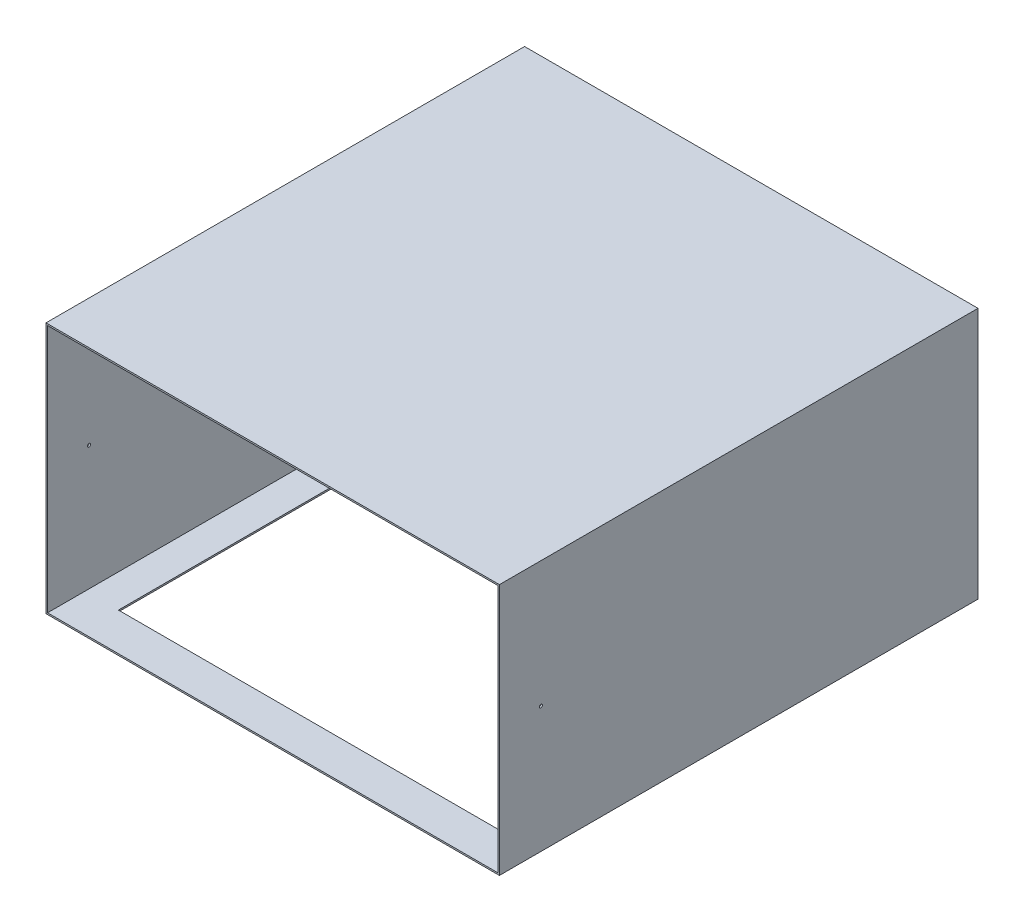
ISO-10303-21;
HEADER;
FILE_DESCRIPTION(('STEP AP214'),'2;1');
FILE_NAME('part.step','',(''),(''),'','','');
FILE_SCHEMA(('AUTOMOTIVE_DESIGN { 1 0 10303 214 1 1 1 1 }'));
ENDSEC;
DATA;
#1=APPLICATION_CONTEXT('core data for automotive mechanical design processes');
#2=APPLICATION_PROTOCOL_DEFINITION('international standard','automotive_design',2000,#1);
#3=PRODUCT_CONTEXT('',#1,'mechanical');
#4=PRODUCT('Part','Part','',(#3));
#5=PRODUCT_RELATED_PRODUCT_CATEGORY('part','',(#4));
#6=PRODUCT_DEFINITION_FORMATION('','',#4);
#7=PRODUCT_DEFINITION_CONTEXT('part definition',#1,'design');
#8=PRODUCT_DEFINITION('design','',#6,#7);
#9=PRODUCT_DEFINITION_SHAPE('','',#8);
#10=(LENGTH_UNIT() NAMED_UNIT(*) SI_UNIT(.MILLI.,.METRE.));
#11=(NAMED_UNIT(*) PLANE_ANGLE_UNIT() SI_UNIT($,.RADIAN.));
#12=(NAMED_UNIT(*) SI_UNIT($,.STERADIAN.) SOLID_ANGLE_UNIT());
#13=UNCERTAINTY_MEASURE_WITH_UNIT(LENGTH_MEASURE(1.E-05),#10,'distance_accuracy_value','');
#14=(GEOMETRIC_REPRESENTATION_CONTEXT(3) GLOBAL_UNCERTAINTY_ASSIGNED_CONTEXT((#13)) GLOBAL_UNIT_ASSIGNED_CONTEXT((#10,
#11,#12)) REPRESENTATION_CONTEXT('',''));
#15=CARTESIAN_POINT('',(0.,0.,0.));
#16=DIRECTION('',(0.,0.,1.));
#17=DIRECTION('',(1.,0.,0.));
#18=AXIS2_PLACEMENT_3D('',#15,#16,#17);
#19=CARTESIAN_POINT('',(966.106853773985,0.,-83.6587009133541));
#20=DIRECTION('',(-1.,0.,0.));
#21=DIRECTION('',(0.,0.,1.));
#22=AXIS2_PLACEMENT_3D('',#19,#20,#21);
#23=CYLINDRICAL_SURFACE('',#22,3.175);
#24=CARTESIAN_POINT('',(-457.2,0.,-83.6587009133541));
#25=DIRECTION('',(1.,0.,0.));
#26=DIRECTION('',(0.,1.,0.));
#27=AXIS2_PLACEMENT_3D('',#24,#25,#26);
#28=CIRCLE('',#27,3.175);
#29=CARTESIAN_POINT('',(-457.2,3.175,-83.6587009133541));
#30=VERTEX_POINT('',#29);
#31=EDGE_CURVE('E126',#30,#30,#28,.T.);
#32=ORIENTED_EDGE('',*,*,#31,.F.);
#33=EDGE_LOOP('',(#32));
#34=FACE_BOUND('',#33,.T.);
#35=CARTESIAN_POINT('',(-454.025,0.,-83.6587009133541));
#36=DIRECTION('',(-1.,0.,0.));
#37=DIRECTION('',(0.,0.,1.));
#38=AXIS2_PLACEMENT_3D('',#35,#36,#37);
#39=CIRCLE('',#38,3.175);
#40=CARTESIAN_POINT('',(-454.025,0.,-80.4837009133541));
#41=VERTEX_POINT('',#40);
#42=EDGE_CURVE('E187',#41,#41,#39,.T.);
#43=ORIENTED_EDGE('',*,*,#42,.F.);
#44=EDGE_LOOP('',(#43));
#45=FACE_BOUND('',#44,.T.);
#46=ADVANCED_FACE('F16',(#34,#45),#23,.F.);
#47=CARTESIAN_POINT('',(966.106853773985,0.,-83.6587009133541));
#48=DIRECTION('',(-1.,0.,0.));
#49=DIRECTION('',(0.,0.,1.));
#50=AXIS2_PLACEMENT_3D('',#47,#48,#49);
#51=CYLINDRICAL_SURFACE('',#50,3.175);
#52=CARTESIAN_POINT('',(454.025,0.,-83.6587009133541));
#53=DIRECTION('',(1.,0.,0.));
#54=DIRECTION('',(0.,1.,0.));
#55=AXIS2_PLACEMENT_3D('',#52,#53,#54);
#56=CIRCLE('',#55,3.175);
#57=CARTESIAN_POINT('',(454.025,3.175,-83.6587009133541));
#58=VERTEX_POINT('',#57);
#59=EDGE_CURVE('E184',#58,#58,#56,.T.);
#60=ORIENTED_EDGE('',*,*,#59,.F.);
#61=EDGE_LOOP('',(#60));
#62=FACE_BOUND('',#61,.T.);
#63=CARTESIAN_POINT('',(457.2,0.,-83.6587009133541));
#64=DIRECTION('',(-1.,0.,0.));
#65=DIRECTION('',(0.,0.,1.));
#66=AXIS2_PLACEMENT_3D('',#63,#64,#65);
#67=CIRCLE('',#66,3.175);
#68=CARTESIAN_POINT('',(457.2,0.,-80.4837009133541));
#69=VERTEX_POINT('',#68);
#70=EDGE_CURVE('E180',#69,#69,#67,.T.);
#71=ORIENTED_EDGE('',*,*,#70,.F.);
#72=EDGE_LOOP('',(#71));
#73=FACE_BOUND('',#72,.T.);
#74=ADVANCED_FACE('F18',(#62,#73),#51,.F.);
#75=CARTESIAN_POINT('',(387.35,-254.,-76.1999999999999));
#76=DIRECTION('',(1.,0.,0.));
#77=DIRECTION('',(0.,0.,-1.));
#78=AXIS2_PLACEMENT_3D('',#75,#76,#77);
#79=PLANE('',#78);
#80=DIRECTION('',(0.,0.,1.));
#81=VECTOR('',#80,1.);
#82=CARTESIAN_POINT('',(387.35,-250.825,-736.6));
#83=LINE('',#82,#81);
#84=CARTESIAN_POINT('',(387.35,-250.825,-736.6));
#85=VERTEX_POINT('',#84);
#86=CARTESIAN_POINT('',(387.35,-250.825,-76.1999999999999));
#87=VERTEX_POINT('',#86);
#88=EDGE_CURVE('E34',#85,#87,#83,.T.);
#89=ORIENTED_EDGE('',*,*,#88,.F.);
#90=DIRECTION('',(0.,1.,0.));
#91=VECTOR('',#90,1.);
#92=CARTESIAN_POINT('',(387.35,-254.,-736.6));
#93=LINE('',#92,#91);
#94=CARTESIAN_POINT('',(387.35,-254.,-736.6));
#95=VERTEX_POINT('',#94);
#96=EDGE_CURVE('E26',#95,#85,#93,.T.);
#97=ORIENTED_EDGE('',*,*,#96,.F.);
#98=DIRECTION('',(0.,0.,-1.));
#99=VECTOR('',#98,1.);
#100=CARTESIAN_POINT('',(387.35,-254.,-76.1999999999999));
#101=LINE('',#100,#99);
#102=CARTESIAN_POINT('',(387.35,-254.,-76.1999999999999));
#103=VERTEX_POINT('',#102);
#104=EDGE_CURVE('E134',#103,#95,#101,.T.);
#105=ORIENTED_EDGE('',*,*,#104,.F.);
#106=DIRECTION('',(0.,1.,0.));
#107=VECTOR('',#106,1.);
#108=CARTESIAN_POINT('',(387.35,-254.,-76.1999999999999));
#109=LINE('',#108,#107);
#110=EDGE_CURVE('E10',#103,#87,#109,.T.);
#111=ORIENTED_EDGE('',*,*,#110,.T.);
#112=EDGE_LOOP('',(#89,#97,#105,#111));
#113=FACE_BOUND('',#112,.T.);
#114=ADVANCED_FACE('F233',(#113),#79,.F.);
#115=CARTESIAN_POINT('',(387.35,-254.,-736.6));
#116=DIRECTION('',(0.,0.,-1.));
#117=DIRECTION('',(-1.,0.,0.));
#118=AXIS2_PLACEMENT_3D('',#115,#116,#117);
#119=PLANE('',#118);
#120=DIRECTION('',(1.,0.,0.));
#121=VECTOR('',#120,1.);
#122=CARTESIAN_POINT('',(-387.35,-250.825,-736.6));
#123=LINE('',#122,#121);
#124=CARTESIAN_POINT('',(-387.35,-250.825,-736.6));
#125=VERTEX_POINT('',#124);
#126=EDGE_CURVE('E157',#125,#85,#123,.T.);
#127=ORIENTED_EDGE('',*,*,#126,.F.);
#128=DIRECTION('',(0.,1.,0.));
#129=VECTOR('',#128,1.);
#130=CARTESIAN_POINT('',(-387.35,-254.,-736.6));
#131=LINE('',#130,#129);
#132=CARTESIAN_POINT('',(-387.35,-254.,-736.6));
#133=VERTEX_POINT('',#132);
#134=EDGE_CURVE('E143',#133,#125,#131,.T.);
#135=ORIENTED_EDGE('',*,*,#134,.F.);
#136=DIRECTION('',(-1.,0.,0.));
#137=VECTOR('',#136,1.);
#138=CARTESIAN_POINT('',(387.35,-254.,-736.6));
#139=LINE('',#138,#137);
#140=EDGE_CURVE('E133',#95,#133,#139,.T.);
#141=ORIENTED_EDGE('',*,*,#140,.F.);
#142=ORIENTED_EDGE('',*,*,#96,.T.);
#143=EDGE_LOOP('',(#127,#135,#141,#142));
#144=FACE_BOUND('',#143,.T.);
#145=ADVANCED_FACE('F278',(#144),#119,.F.);
#146=CARTESIAN_POINT('',(-387.35,-254.,-76.1999999999999));
#147=DIRECTION('',(0.,0.,1.));
#148=DIRECTION('',(1.,0.,0.));
#149=AXIS2_PLACEMENT_3D('',#146,#147,#148);
#150=PLANE('',#149);
#151=DIRECTION('',(-1.,0.,0.));
#152=VECTOR('',#151,1.);
#153=CARTESIAN_POINT('',(387.35,-250.825,-76.1999999999999));
#154=LINE('',#153,#152);
#155=CARTESIAN_POINT('',(-387.35,-250.825,-76.1999999999999));
#156=VERTEX_POINT('',#155);
#157=EDGE_CURVE('E145',#87,#156,#154,.T.);
#158=ORIENTED_EDGE('',*,*,#157,.F.);
#159=ORIENTED_EDGE('',*,*,#110,.F.);
#160=DIRECTION('',(1.,0.,0.));
#161=VECTOR('',#160,1.);
#162=CARTESIAN_POINT('',(-387.35,-254.,-76.1999999999999));
#163=LINE('',#162,#161);
#164=CARTESIAN_POINT('',(-387.35,-254.,-76.1999999999999));
#165=VERTEX_POINT('',#164);
#166=EDGE_CURVE('E139',#165,#103,#163,.T.);
#167=ORIENTED_EDGE('',*,*,#166,.F.);
#168=DIRECTION('',(0.,1.,0.));
#169=VECTOR('',#168,1.);
#170=CARTESIAN_POINT('',(-387.35,-254.,-76.1999999999999));
#171=LINE('',#170,#169);
#172=EDGE_CURVE('E150',#165,#156,#171,.T.);
#173=ORIENTED_EDGE('',*,*,#172,.T.);
#174=EDGE_LOOP('',(#158,#159,#167,#173));
#175=FACE_BOUND('',#174,.T.);
#176=ADVANCED_FACE('F285',(#175),#150,.F.);
#177=CARTESIAN_POINT('',(-387.35,-254.,-736.6));
#178=DIRECTION('',(-1.,0.,0.));
#179=DIRECTION('',(0.,0.,1.));
#180=AXIS2_PLACEMENT_3D('',#177,#178,#179);
#181=PLANE('',#180);
#182=DIRECTION('',(0.,0.,-1.));
#183=VECTOR('',#182,1.);
#184=CARTESIAN_POINT('',(-387.35,-250.825,-76.1999999999999));
#185=LINE('',#184,#183);
#186=EDGE_CURVE('E153',#156,#125,#185,.T.);
#187=ORIENTED_EDGE('',*,*,#186,.F.);
#188=ORIENTED_EDGE('',*,*,#172,.F.);
#189=DIRECTION('',(0.,0.,1.));
#190=VECTOR('',#189,1.);
#191=CARTESIAN_POINT('',(-387.35,-254.,-736.6));
#192=LINE('',#191,#190);
#193=EDGE_CURVE('E127',#133,#165,#192,.T.);
#194=ORIENTED_EDGE('',*,*,#193,.F.);
#195=ORIENTED_EDGE('',*,*,#134,.T.);
#196=EDGE_LOOP('',(#187,#188,#194,#195));
#197=FACE_BOUND('',#196,.T.);
#198=ADVANCED_FACE('F225',(#197),#181,.F.);
#199=CARTESIAN_POINT('',(-457.2,250.825,0.));
#200=DIRECTION('',(0.,1.,0.));
#201=DIRECTION('',(0.,0.,1.));
#202=AXIS2_PLACEMENT_3D('',#199,#200,#201);
#203=PLANE('',#202);
#204=DIRECTION('',(1.,0.,0.));
#205=VECTOR('',#204,1.);
#206=CARTESIAN_POINT('',(-454.025,250.825,0.));
#207=LINE('',#206,#205);
#208=CARTESIAN_POINT('',(-454.025,250.825,0.));
#209=VERTEX_POINT('',#208);
#210=CARTESIAN_POINT('',(454.025,250.825,0.));
#211=VERTEX_POINT('',#210);
#212=EDGE_CURVE('E159',#209,#211,#207,.T.);
#213=ORIENTED_EDGE('',*,*,#212,.F.);
#214=DIRECTION('',(0.,0.,-1.));
#215=VECTOR('',#214,1.);
#216=CARTESIAN_POINT('',(-454.025,250.825,-962.025));
#217=LINE('',#216,#215);
#218=CARTESIAN_POINT('',(-454.025,250.825,-962.025));
#219=VERTEX_POINT('',#218);
#220=EDGE_CURVE('E163',#209,#219,#217,.T.);
#221=ORIENTED_EDGE('',*,*,#220,.T.);
#222=DIRECTION('',(1.,0.,0.));
#223=VECTOR('',#222,1.);
#224=CARTESIAN_POINT('',(-454.025,250.825,-962.025));
#225=LINE('',#224,#223);
#226=CARTESIAN_POINT('',(454.025,250.825,-962.025));
#227=VERTEX_POINT('',#226);
#228=EDGE_CURVE('E166',#219,#227,#225,.T.);
#229=ORIENTED_EDGE('',*,*,#228,.T.);
#230=DIRECTION('',(0.,0.,-1.));
#231=VECTOR('',#230,1.);
#232=CARTESIAN_POINT('',(454.025,250.825,-962.025));
#233=LINE('',#232,#231);
#234=EDGE_CURVE('E170',#211,#227,#233,.T.);
#235=ORIENTED_EDGE('',*,*,#234,.F.);
#236=EDGE_LOOP('',(#213,#221,#229,#235));
#237=FACE_BOUND('',#236,.T.);
#238=ADVANCED_FACE('F215',(#237),#203,.F.);
#239=CARTESIAN_POINT('',(-457.2,254.,0.));
#240=DIRECTION('',(0.,1.,0.));
#241=DIRECTION('',(0.,0.,1.));
#242=AXIS2_PLACEMENT_3D('',#239,#240,#241);
#243=PLANE('',#242);
#244=DIRECTION('',(-1.,0.,0.));
#245=VECTOR('',#244,1.);
#246=CARTESIAN_POINT('',(457.2,254.,0.));
#247=LINE('',#246,#245);
#248=CARTESIAN_POINT('',(457.2,254.,0.));
#249=VERTEX_POINT('',#248);
#250=CARTESIAN_POINT('',(-457.2,254.,0.));
#251=VERTEX_POINT('',#250);
#252=EDGE_CURVE('E173',#249,#251,#247,.T.);
#253=ORIENTED_EDGE('',*,*,#252,.F.);
#254=DIRECTION('',(0.,0.,-1.));
#255=VECTOR('',#254,1.);
#256=CARTESIAN_POINT('',(457.2,254.,0.));
#257=LINE('',#256,#255);
#258=CARTESIAN_POINT('',(457.2,254.,-965.2));
#259=VERTEX_POINT('',#258);
#260=EDGE_CURVE('E169',#249,#259,#257,.T.);
#261=ORIENTED_EDGE('',*,*,#260,.T.);
#262=DIRECTION('',(1.,0.,0.));
#263=VECTOR('',#262,1.);
#264=CARTESIAN_POINT('',(-457.2,254.,-965.2));
#265=LINE('',#264,#263);
#266=CARTESIAN_POINT('',(-457.2,254.,-965.2));
#267=VERTEX_POINT('',#266);
#268=EDGE_CURVE('E118',#267,#259,#265,.T.);
#269=ORIENTED_EDGE('',*,*,#268,.F.);
#270=DIRECTION('',(0.,0.,-1.));
#271=VECTOR('',#270,1.);
#272=CARTESIAN_POINT('',(-457.2,254.,0.));
#273=LINE('',#272,#271);
#274=EDGE_CURVE('E115',#251,#267,#273,.T.);
#275=ORIENTED_EDGE('',*,*,#274,.F.);
#276=EDGE_LOOP('',(#253,#261,#269,#275));
#277=FACE_BOUND('',#276,.T.);
#278=ADVANCED_FACE('F212',(#277),#243,.T.);
#279=CARTESIAN_POINT('',(454.025,254.,0.));
#280=DIRECTION('',(1.,0.,0.));
#281=DIRECTION('',(0.,0.,-1.));
#282=AXIS2_PLACEMENT_3D('',#279,#280,#281);
#283=PLANE('',#282);
#284=DIRECTION('',(0.,-1.,0.));
#285=VECTOR('',#284,1.);
#286=CARTESIAN_POINT('',(454.025,250.825,0.));
#287=LINE('',#286,#285);
#288=CARTESIAN_POINT('',(454.025,-250.825,0.));
#289=VERTEX_POINT('',#288);
#290=EDGE_CURVE('E162',#211,#289,#287,.T.);
#291=ORIENTED_EDGE('',*,*,#290,.F.);
#292=ORIENTED_EDGE('',*,*,#234,.T.);
#293=DIRECTION('',(0.,-1.,0.));
#294=VECTOR('',#293,1.);
#295=CARTESIAN_POINT('',(454.025,250.825,-962.025));
#296=LINE('',#295,#294);
#297=CARTESIAN_POINT('',(454.025,-250.825,-962.025));
#298=VERTEX_POINT('',#297);
#299=EDGE_CURVE('E172',#227,#298,#296,.T.);
#300=ORIENTED_EDGE('',*,*,#299,.T.);
#301=DIRECTION('',(0.,0.,-1.));
#302=VECTOR('',#301,1.);
#303=CARTESIAN_POINT('',(454.025,-250.825,0.));
#304=LINE('',#303,#302);
#305=EDGE_CURVE('E185',#289,#298,#304,.T.);
#306=ORIENTED_EDGE('',*,*,#305,.F.);
#307=EDGE_LOOP('',(#291,#292,#300,#306));
#308=FACE_BOUND('',#307,.T.);
#309=ORIENTED_EDGE('',*,*,#59,.T.);
#310=EDGE_LOOP('',(#309));
#311=FACE_BOUND('',#310,.T.);
#312=ADVANCED_FACE('F214',(#308,#311),#283,.F.);
#313=CARTESIAN_POINT('',(-454.025,-254.,0.));
#314=DIRECTION('',(-1.,0.,0.));
#315=DIRECTION('',(0.,0.,1.));
#316=AXIS2_PLACEMENT_3D('',#313,#314,#315);
#317=PLANE('',#316);
#318=DIRECTION('',(0.,1.,0.));
#319=VECTOR('',#318,1.);
#320=CARTESIAN_POINT('',(-454.025,-250.825,0.));
#321=LINE('',#320,#319);
#322=CARTESIAN_POINT('',(-454.025,-250.825,0.));
#323=VERTEX_POINT('',#322);
#324=EDGE_CURVE('E161',#323,#209,#321,.T.);
#325=ORIENTED_EDGE('',*,*,#324,.F.);
#326=DIRECTION('',(0.,0.,-1.));
#327=VECTOR('',#326,1.);
#328=CARTESIAN_POINT('',(-454.025,-250.825,-962.025));
#329=LINE('',#328,#327);
#330=CARTESIAN_POINT('',(-454.025,-250.825,-962.025));
#331=VERTEX_POINT('',#330);
#332=EDGE_CURVE('E191',#323,#331,#329,.T.);
#333=ORIENTED_EDGE('',*,*,#332,.T.);
#334=DIRECTION('',(0.,1.,0.));
#335=VECTOR('',#334,1.);
#336=CARTESIAN_POINT('',(-454.025,-250.825,-962.025));
#337=LINE('',#336,#335);
#338=EDGE_CURVE('E194',#331,#219,#337,.T.);
#339=ORIENTED_EDGE('',*,*,#338,.T.);
#340=ORIENTED_EDGE('',*,*,#220,.F.);
#341=EDGE_LOOP('',(#325,#333,#339,#340));
#342=FACE_BOUND('',#341,.T.);
#343=ORIENTED_EDGE('',*,*,#42,.T.);
#344=EDGE_LOOP('',(#343));
#345=FACE_BOUND('',#344,.T.);
#346=ADVANCED_FACE('F222',(#342,#345),#317,.F.);
#347=CARTESIAN_POINT('',(457.2,-250.825,0.));
#348=DIRECTION('',(0.,-1.,0.));
#349=DIRECTION('',(0.,0.,-1.));
#350=AXIS2_PLACEMENT_3D('',#347,#348,#349);
#351=PLANE('',#350);
#352=DIRECTION('',(-1.,0.,0.));
#353=VECTOR('',#352,1.);
#354=CARTESIAN_POINT('',(454.025,-250.825,0.));
#355=LINE('',#354,#353);
#356=EDGE_CURVE('E190',#289,#323,#355,.T.);
#357=ORIENTED_EDGE('',*,*,#356,.F.);
#358=ORIENTED_EDGE('',*,*,#305,.T.);
#359=DIRECTION('',(-1.,0.,0.));
#360=VECTOR('',#359,1.);
#361=CARTESIAN_POINT('',(454.025,-250.825,-962.025));
#362=LINE('',#361,#360);
#363=EDGE_CURVE('E156',#298,#331,#362,.T.);
#364=ORIENTED_EDGE('',*,*,#363,.T.);
#365=ORIENTED_EDGE('',*,*,#332,.F.);
#366=EDGE_LOOP('',(#357,#358,#364,#365));
#367=FACE_BOUND('',#366,.T.);
#368=ORIENTED_EDGE('',*,*,#186,.T.);
#369=ORIENTED_EDGE('',*,*,#126,.T.);
#370=ORIENTED_EDGE('',*,*,#88,.T.);
#371=ORIENTED_EDGE('',*,*,#157,.T.);
#372=EDGE_LOOP('',(#368,#369,#370,#371));
#373=FACE_BOUND('',#372,.T.);
#374=ADVANCED_FACE('F251',(#367,#373),#351,.F.);
#375=CARTESIAN_POINT('',(0.,0.,-962.025));
#376=DIRECTION('',(0.,0.,1.));
#377=DIRECTION('',(1.,0.,0.));
#378=AXIS2_PLACEMENT_3D('',#375,#376,#377);
#379=PLANE('',#378);
#380=ORIENTED_EDGE('',*,*,#363,.F.);
#381=ORIENTED_EDGE('',*,*,#299,.F.);
#382=ORIENTED_EDGE('',*,*,#228,.F.);
#383=ORIENTED_EDGE('',*,*,#338,.F.);
#384=EDGE_LOOP('',(#380,#381,#382,#383));
#385=FACE_BOUND('',#384,.T.);
#386=ADVANCED_FACE('F248',(#385),#379,.T.);
#387=CARTESIAN_POINT('',(457.2,254.,0.));
#388=DIRECTION('',(1.,0.,0.));
#389=DIRECTION('',(0.,0.,-1.));
#390=AXIS2_PLACEMENT_3D('',#387,#388,#389);
#391=PLANE('',#390);
#392=DIRECTION('',(0.,1.,0.));
#393=VECTOR('',#392,1.);
#394=CARTESIAN_POINT('',(457.2,-254.,0.));
#395=LINE('',#394,#393);
#396=CARTESIAN_POINT('',(457.2,-254.,0.));
#397=VERTEX_POINT('',#396);
#398=EDGE_CURVE('E175',#397,#249,#395,.T.);
#399=ORIENTED_EDGE('',*,*,#398,.F.);
#400=DIRECTION('',(0.,0.,-1.));
#401=VECTOR('',#400,1.);
#402=CARTESIAN_POINT('',(457.2,-254.,0.));
#403=LINE('',#402,#401);
#404=CARTESIAN_POINT('',(457.2,-254.,-965.2));
#405=VERTEX_POINT('',#404);
#406=EDGE_CURVE('E147',#397,#405,#403,.T.);
#407=ORIENTED_EDGE('',*,*,#406,.T.);
#408=DIRECTION('',(0.,-1.,0.));
#409=VECTOR('',#408,1.);
#410=CARTESIAN_POINT('',(457.2,254.,-965.2));
#411=LINE('',#410,#409);
#412=EDGE_CURVE('E131',#259,#405,#411,.T.);
#413=ORIENTED_EDGE('',*,*,#412,.F.);
#414=ORIENTED_EDGE('',*,*,#260,.F.);
#415=EDGE_LOOP('',(#399,#407,#413,#414));
#416=FACE_BOUND('',#415,.T.);
#417=ORIENTED_EDGE('',*,*,#70,.T.);
#418=EDGE_LOOP('',(#417));
#419=FACE_BOUND('',#418,.T.);
#420=ADVANCED_FACE('F209',(#416,#419),#391,.T.);
#421=CARTESIAN_POINT('',(-457.2,-254.,0.));
#422=DIRECTION('',(-1.,0.,0.));
#423=DIRECTION('',(0.,0.,1.));
#424=AXIS2_PLACEMENT_3D('',#421,#422,#423);
#425=PLANE('',#424);
#426=DIRECTION('',(0.,-1.,0.));
#427=VECTOR('',#426,1.);
#428=CARTESIAN_POINT('',(-457.2,254.,0.));
#429=LINE('',#428,#427);
#430=CARTESIAN_POINT('',(-457.2,-254.,0.));
#431=VERTEX_POINT('',#430);
#432=EDGE_CURVE('E102',#251,#431,#429,.T.);
#433=ORIENTED_EDGE('',*,*,#432,.F.);
#434=ORIENTED_EDGE('',*,*,#274,.T.);
#435=DIRECTION('',(0.,1.,0.));
#436=VECTOR('',#435,1.);
#437=CARTESIAN_POINT('',(-457.2,-254.,-965.2));
#438=LINE('',#437,#436);
#439=CARTESIAN_POINT('',(-457.2,-254.,-965.2));
#440=VERTEX_POINT('',#439);
#441=EDGE_CURVE('E108',#440,#267,#438,.T.);
#442=ORIENTED_EDGE('',*,*,#441,.F.);
#443=DIRECTION('',(0.,0.,-1.));
#444=VECTOR('',#443,1.);
#445=CARTESIAN_POINT('',(-457.2,-254.,0.));
#446=LINE('',#445,#444);
#447=EDGE_CURVE('E112',#431,#440,#446,.T.);
#448=ORIENTED_EDGE('',*,*,#447,.F.);
#449=EDGE_LOOP('',(#433,#434,#442,#448));
#450=FACE_BOUND('',#449,.T.);
#451=ORIENTED_EDGE('',*,*,#31,.T.);
#452=EDGE_LOOP('',(#451));
#453=FACE_BOUND('',#452,.T.);
#454=ADVANCED_FACE('F110',(#450,#453),#425,.T.);
#455=CARTESIAN_POINT('',(457.2,-254.,0.));
#456=DIRECTION('',(0.,-1.,0.));
#457=DIRECTION('',(0.,0.,-1.));
#458=AXIS2_PLACEMENT_3D('',#455,#456,#457);
#459=PLANE('',#458);
#460=DIRECTION('',(1.,0.,0.));
#461=VECTOR('',#460,1.);
#462=CARTESIAN_POINT('',(-457.2,-254.,0.));
#463=LINE('',#462,#461);
#464=EDGE_CURVE('E125',#431,#397,#463,.T.);
#465=ORIENTED_EDGE('',*,*,#464,.F.);
#466=ORIENTED_EDGE('',*,*,#447,.T.);
#467=DIRECTION('',(-1.,0.,0.));
#468=VECTOR('',#467,1.);
#469=CARTESIAN_POINT('',(457.2,-254.,-965.2));
#470=LINE('',#469,#468);
#471=EDGE_CURVE('E20',#405,#440,#470,.T.);
#472=ORIENTED_EDGE('',*,*,#471,.F.);
#473=ORIENTED_EDGE('',*,*,#406,.F.);
#474=EDGE_LOOP('',(#465,#466,#472,#473));
#475=FACE_BOUND('',#474,.T.);
#476=ORIENTED_EDGE('',*,*,#193,.T.);
#477=ORIENTED_EDGE('',*,*,#166,.T.);
#478=ORIENTED_EDGE('',*,*,#104,.T.);
#479=ORIENTED_EDGE('',*,*,#140,.T.);
#480=EDGE_LOOP('',(#476,#477,#478,#479));
#481=FACE_BOUND('',#480,.T.);
#482=ADVANCED_FACE('F122',(#475,#481),#459,.T.);
#483=CARTESIAN_POINT('',(0.,0.,-965.2));
#484=DIRECTION('',(0.,0.,1.));
#485=DIRECTION('',(1.,0.,0.));
#486=AXIS2_PLACEMENT_3D('',#483,#484,#485);
#487=PLANE('',#486);
#488=ORIENTED_EDGE('',*,*,#471,.T.);
#489=ORIENTED_EDGE('',*,*,#441,.T.);
#490=ORIENTED_EDGE('',*,*,#268,.T.);
#491=ORIENTED_EDGE('',*,*,#412,.T.);
#492=EDGE_LOOP('',(#488,#489,#490,#491));
#493=FACE_BOUND('',#492,.T.);
#494=ADVANCED_FACE('F129',(#493),#487,.F.);
#495=CARTESIAN_POINT('',(0.,0.,0.));
#496=DIRECTION('',(0.,0.,1.));
#497=DIRECTION('',(1.,0.,0.));
#498=AXIS2_PLACEMENT_3D('',#495,#496,#497);
#499=PLANE('',#498);
#500=ORIENTED_EDGE('',*,*,#464,.T.);
#501=ORIENTED_EDGE('',*,*,#398,.T.);
#502=ORIENTED_EDGE('',*,*,#252,.T.);
#503=ORIENTED_EDGE('',*,*,#432,.T.);
#504=EDGE_LOOP('',(#500,#501,#502,#503));
#505=FACE_BOUND('',#504,.T.);
#506=ORIENTED_EDGE('',*,*,#356,.T.);
#507=ORIENTED_EDGE('',*,*,#324,.T.);
#508=ORIENTED_EDGE('',*,*,#212,.T.);
#509=ORIENTED_EDGE('',*,*,#290,.T.);
#510=EDGE_LOOP('',(#506,#507,#508,#509));
#511=FACE_BOUND('',#510,.T.);
#512=ADVANCED_FACE('F205',(#505,#511),#499,.T.);
#513=CLOSED_SHELL('',(#46,#74,#114,#145,#176,#198,#238,#278,#312,#346,#374,#386,#420,#454,#482,
#494,#512));
#514=MANIFOLD_SOLID_BREP('B1',#513);
#515=ADVANCED_BREP_SHAPE_REPRESENTATION('',(#18,#514),#14);
#516=SHAPE_DEFINITION_REPRESENTATION(#9,#515);
ENDSEC;
END-ISO-10303-21;
